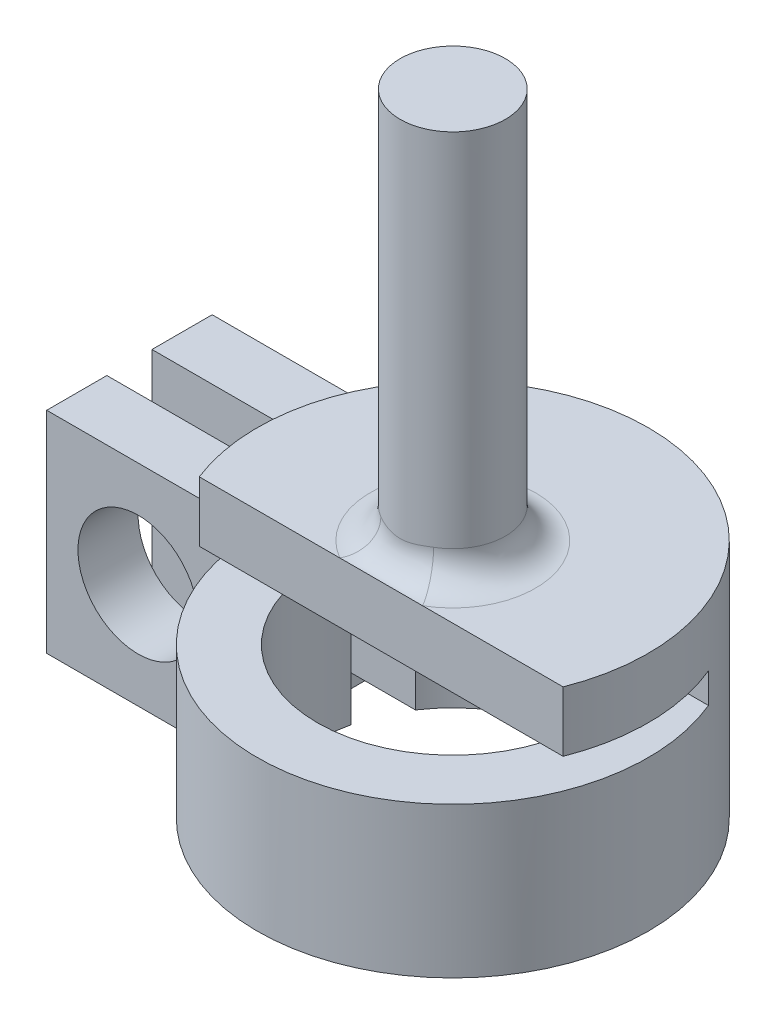
ISO-10303-21;
HEADER;
FILE_DESCRIPTION(('STEP AP214'),'2;1');
FILE_NAME('part.step','',(''),(''),'','','');
FILE_SCHEMA(('AUTOMOTIVE_DESIGN { 1 0 10303 214 1 1 1 1 }'));
ENDSEC;
DATA;
#1=APPLICATION_CONTEXT('core data for automotive mechanical design processes');
#2=APPLICATION_PROTOCOL_DEFINITION('international standard','automotive_design',2000,#1);
#3=PRODUCT_CONTEXT('',#1,'mechanical');
#4=PRODUCT('Part','Part','',(#3));
#5=PRODUCT_RELATED_PRODUCT_CATEGORY('part','',(#4));
#6=PRODUCT_DEFINITION_FORMATION('','',#4);
#7=PRODUCT_DEFINITION_CONTEXT('part definition',#1,'design');
#8=PRODUCT_DEFINITION('design','',#6,#7);
#9=PRODUCT_DEFINITION_SHAPE('','',#8);
#10=(LENGTH_UNIT() NAMED_UNIT(*) SI_UNIT(.MILLI.,.METRE.));
#11=(NAMED_UNIT(*) PLANE_ANGLE_UNIT() SI_UNIT($,.RADIAN.));
#12=(NAMED_UNIT(*) SI_UNIT($,.STERADIAN.) SOLID_ANGLE_UNIT());
#13=UNCERTAINTY_MEASURE_WITH_UNIT(LENGTH_MEASURE(1.E-05),#10,'distance_accuracy_value','');
#14=(GEOMETRIC_REPRESENTATION_CONTEXT(3) GLOBAL_UNCERTAINTY_ASSIGNED_CONTEXT((#13)) GLOBAL_UNIT_ASSIGNED_CONTEXT((#10,
#11,#12)) REPRESENTATION_CONTEXT('',''));
#15=CARTESIAN_POINT('',(0.,0.,0.));
#16=DIRECTION('',(0.,0.,1.));
#17=DIRECTION('',(1.,0.,0.));
#18=AXIS2_PLACEMENT_3D('',#15,#16,#17);
#19=CARTESIAN_POINT('',(0.,5.,0.));
#20=DIRECTION('',(0.,1.,0.));
#21=DIRECTION('',(0.,0.,1.));
#22=AXIS2_PLACEMENT_3D('',#19,#20,#21);
#23=PLANE('',#22);
#24=DIRECTION('',(1.,0.,0.));
#25=VECTOR('',#24,1.);
#26=CARTESIAN_POINT('',(-12.5,5.,-2.5));
#27=LINE('',#26,#25);
#28=CARTESIAN_POINT('',(-6.42261628933256,5.,-2.5));
#29=VERTEX_POINT('',#28);
#30=CARTESIAN_POINT('',(-6.,5.,-2.5));
#31=VERTEX_POINT('',#30);
#32=EDGE_CURVE('E337',#29,#31,#27,.T.);
#33=ORIENTED_EDGE('',*,*,#32,.T.);
#34=CARTESIAN_POINT('',(0.,5.,0.));
#35=DIRECTION('',(0.,1.,0.));
#36=DIRECTION('',(0.,0.,1.));
#37=AXIS2_PLACEMENT_3D('',#34,#35,#36);
#38=CIRCLE('',#37,6.5);
#39=CARTESIAN_POINT('',(-4.69041575982343,5.,-4.5));
#40=VERTEX_POINT('',#39);
#41=EDGE_CURVE('E224',#40,#31,#38,.T.);
#42=ORIENTED_EDGE('',*,*,#41,.F.);
#43=DIRECTION('',(-1.,0.,0.));
#44=VECTOR('',#43,1.);
#45=CARTESIAN_POINT('',(-4.69041575982343,5.,-4.5));
#46=LINE('',#45,#44);
#47=CARTESIAN_POINT('',(-6.42261628933256,5.,-4.5));
#48=VERTEX_POINT('',#47);
#49=EDGE_CURVE('E332',#40,#48,#46,.T.);
#50=ORIENTED_EDGE('',*,*,#49,.T.);
#51=DIRECTION('',(0.,0.,1.));
#52=VECTOR('',#51,1.);
#53=CARTESIAN_POINT('',(-6.42261628933256,5.,-10.6591064909357));
#54=LINE('',#53,#52);
#55=EDGE_CURVE('E319',#48,#29,#54,.T.);
#56=ORIENTED_EDGE('',*,*,#55,.T.);
#57=EDGE_LOOP('',(#33,#42,#50,#56));
#58=FACE_BOUND('',#57,.T.);
#59=ADVANCED_FACE('F39',(#58),#23,.T.);
#60=DIRECTION('',(1.,0.,0.));
#61=VECTOR('',#60,1.);
#62=CARTESIAN_POINT('',(4.89897948556636,5.,-2.5));
#63=LINE('',#62,#61);
#64=CARTESIAN_POINT('',(4.89897948556636,5.,-2.5));
#65=VERTEX_POINT('',#64);
#66=CARTESIAN_POINT('',(6.,5.,-2.5));
#67=VERTEX_POINT('',#66);
#68=EDGE_CURVE('E236',#65,#67,#63,.T.);
#69=ORIENTED_EDGE('',*,*,#68,.F.);
#70=CARTESIAN_POINT('',(0.,5.,0.));
#71=DIRECTION('',(0.,-1.,0.));
#72=DIRECTION('',(0.,0.,1.));
#73=AXIS2_PLACEMENT_3D('',#70,#71,#72);
#74=CIRCLE('',#73,5.5);
#75=CARTESIAN_POINT('',(-4.89897948556635,5.,-2.5));
#76=VERTEX_POINT('',#75);
#77=EDGE_CURVE('E227',#76,#65,#74,.T.);
#78=ORIENTED_EDGE('',*,*,#77,.F.);
#79=CARTESIAN_POINT('',(-3.74165738677394,5.,-2.5));
#80=VERTEX_POINT('',#79);
#81=EDGE_CURVE('E336',#76,#80,#27,.T.);
#82=ORIENTED_EDGE('',*,*,#81,.T.);
#83=CARTESIAN_POINT('',(0.,5.,0.));
#84=DIRECTION('',(0.,-1.,0.));
#85=DIRECTION('',(0.,0.,1.));
#86=AXIS2_PLACEMENT_3D('',#83,#84,#85);
#87=CIRCLE('',#86,4.5);
#88=CARTESIAN_POINT('',(-4.38748219369606,5.,-0.999999999999997));
#89=VERTEX_POINT('',#88);
#90=EDGE_CURVE('E339',#80,#89,#87,.T.);
#91=ORIENTED_EDGE('',*,*,#90,.T.);
#92=DIRECTION('',(-1.,0.,0.));
#93=VECTOR('',#92,1.);
#94=CARTESIAN_POINT('',(-4.38748219369606,5.,-0.999999999999998));
#95=LINE('',#94,#93);
#96=CARTESIAN_POINT('',(-6.42261628933256,5.,-1.));
#97=VERTEX_POINT('',#96);
#98=EDGE_CURVE('E341',#89,#97,#95,.T.);
#99=ORIENTED_EDGE('',*,*,#98,.T.);
#100=CARTESIAN_POINT('',(-6.42261628933256,5.,1.));
#101=VERTEX_POINT('',#100);
#102=EDGE_CURVE('E329',#97,#101,#54,.T.);
#103=ORIENTED_EDGE('',*,*,#102,.T.);
#104=CARTESIAN_POINT('',(0.,5.,0.));
#105=DIRECTION('',(0.,1.,0.));
#106=DIRECTION('',(0.,0.,1.));
#107=AXIS2_PLACEMENT_3D('',#104,#105,#106);
#108=CIRCLE('',#107,6.5);
#109=EDGE_CURVE('E330',#101,#67,#108,.T.);
#110=ORIENTED_EDGE('',*,*,#109,.T.);
#111=EDGE_LOOP('',(#69,#78,#82,#91,#99,#103,#110));
#112=FACE_BOUND('',#111,.T.);
#113=ADVANCED_FACE('F442',(#112),#23,.T.);
#114=CARTESIAN_POINT('',(-12.5,5.,-0.999999999999997));
#115=DIRECTION('',(1.,0.,0.));
#116=DIRECTION('',(0.,0.,-1.));
#117=AXIS2_PLACEMENT_3D('',#114,#115,#116);
#118=PLANE('',#117);
#119=DIRECTION('',(0.,0.,1.));
#120=VECTOR('',#119,1.);
#121=CARTESIAN_POINT('',(-12.5,-1.,-10.6591064909357));
#122=LINE('',#121,#120);
#123=CARTESIAN_POINT('',(-12.5,-1.,-4.5));
#124=VERTEX_POINT('',#123);
#125=CARTESIAN_POINT('',(-12.5,-1.,-2.5));
#126=VERTEX_POINT('',#125);
#127=EDGE_CURVE('E302',#124,#126,#122,.T.);
#128=ORIENTED_EDGE('',*,*,#127,.T.);
#129=DIRECTION('',(0.,-1.,0.));
#130=VECTOR('',#129,1.);
#131=CARTESIAN_POINT('',(-12.5,5.,-2.5));
#132=LINE('',#131,#130);
#133=CARTESIAN_POINT('',(-12.5,6.,-2.5));
#134=VERTEX_POINT('',#133);
#135=EDGE_CURVE('E368',#134,#126,#132,.T.);
#136=ORIENTED_EDGE('',*,*,#135,.F.);
#137=DIRECTION('',(0.,0.,1.));
#138=VECTOR('',#137,1.);
#139=CARTESIAN_POINT('',(-12.5,6.,-10.6591064909357));
#140=LINE('',#139,#138);
#141=CARTESIAN_POINT('',(-12.5,6.,-4.5));
#142=VERTEX_POINT('',#141);
#143=EDGE_CURVE('E311',#142,#134,#140,.T.);
#144=ORIENTED_EDGE('',*,*,#143,.F.);
#145=DIRECTION('',(0.,-1.,0.));
#146=VECTOR('',#145,1.);
#147=CARTESIAN_POINT('',(-12.5,5.,-4.5));
#148=LINE('',#147,#146);
#149=EDGE_CURVE('E370',#142,#124,#148,.T.);
#150=ORIENTED_EDGE('',*,*,#149,.T.);
#151=EDGE_LOOP('',(#128,#136,#144,#150));
#152=FACE_BOUND('',#151,.T.);
#153=ADVANCED_FACE('F511',(#152),#118,.F.);
#154=CARTESIAN_POINT('',(-12.5,6.,-10.6591064909357));
#155=DIRECTION('',(0.,1.,0.));
#156=DIRECTION('',(0.,0.,1.));
#157=AXIS2_PLACEMENT_3D('',#154,#155,#156);
#158=PLANE('',#157);
#159=DIRECTION('',(-1.,0.,0.));
#160=VECTOR('',#159,1.);
#161=CARTESIAN_POINT('',(-2.5,6.,-2.5));
#162=LINE('',#161,#160);
#163=CARTESIAN_POINT('',(-6.42261628933256,6.,-2.5));
#164=VERTEX_POINT('',#163);
#165=EDGE_CURVE('E271',#164,#134,#162,.T.);
#166=ORIENTED_EDGE('',*,*,#165,.F.);
#167=DIRECTION('',(0.,0.,1.));
#168=VECTOR('',#167,1.);
#169=CARTESIAN_POINT('',(-6.42261628933256,6.,-10.6591064909357));
#170=LINE('',#169,#168);
#171=CARTESIAN_POINT('',(-6.42261628933256,6.,-4.5));
#172=VERTEX_POINT('',#171);
#173=EDGE_CURVE('E323',#172,#164,#170,.T.);
#174=ORIENTED_EDGE('',*,*,#173,.F.);
#175=DIRECTION('',(1.,0.,0.));
#176=VECTOR('',#175,1.);
#177=CARTESIAN_POINT('',(-12.5,6.,-4.5));
#178=LINE('',#177,#176);
#179=EDGE_CURVE('E310',#142,#172,#178,.T.);
#180=ORIENTED_EDGE('',*,*,#179,.F.);
#181=ORIENTED_EDGE('',*,*,#143,.T.);
#182=EDGE_LOOP('',(#166,#174,#180,#181));
#183=FACE_BOUND('',#182,.T.);
#184=ADVANCED_FACE('F503',(#183),#158,.T.);
#185=CARTESIAN_POINT('',(-6.42261628933256,5.,-10.6591064909357));
#186=DIRECTION('',(1.,0.,0.));
#187=DIRECTION('',(0.,0.,-1.));
#188=AXIS2_PLACEMENT_3D('',#185,#186,#187);
#189=PLANE('',#188);
#190=DIRECTION('',(0.,1.,0.));
#191=VECTOR('',#190,1.);
#192=CARTESIAN_POINT('',(-6.42261628933256,5.,-2.5));
#193=LINE('',#192,#191);
#194=EDGE_CURVE('E282',#29,#164,#193,.T.);
#195=ORIENTED_EDGE('',*,*,#194,.F.);
#196=ORIENTED_EDGE('',*,*,#55,.F.);
#197=DIRECTION('',(0.,-1.,0.));
#198=VECTOR('',#197,1.);
#199=CARTESIAN_POINT('',(-6.42261628933256,5.,-4.5));
#200=LINE('',#199,#198);
#201=EDGE_CURVE('E308',#172,#48,#200,.T.);
#202=ORIENTED_EDGE('',*,*,#201,.F.);
#203=ORIENTED_EDGE('',*,*,#173,.T.);
#204=EDGE_LOOP('',(#195,#196,#202,#203));
#205=FACE_BOUND('',#204,.T.);
#206=ADVANCED_FACE('F495',(#205),#189,.T.);
#207=CARTESIAN_POINT('',(-6.42261628933256,0.,-10.6591064909357));
#208=DIRECTION('',(1.,0.,0.));
#209=DIRECTION('',(0.,0.,-1.));
#210=AXIS2_PLACEMENT_3D('',#207,#208,#209);
#211=PLANE('',#210);
#212=DIRECTION('',(0.,1.,0.));
#213=VECTOR('',#212,1.);
#214=CARTESIAN_POINT('',(-6.42261628933256,0.,-2.5));
#215=LINE('',#214,#213);
#216=CARTESIAN_POINT('',(-6.42261628933256,-1.,-2.5));
#217=VERTEX_POINT('',#216);
#218=CARTESIAN_POINT('',(-6.42261628933256,0.,-2.5));
#219=VERTEX_POINT('',#218);
#220=EDGE_CURVE('E280',#217,#219,#215,.T.);
#221=ORIENTED_EDGE('',*,*,#220,.F.);
#222=DIRECTION('',(0.,0.,1.));
#223=VECTOR('',#222,1.);
#224=CARTESIAN_POINT('',(-6.42261628933256,-1.,-10.6591064909357));
#225=LINE('',#224,#223);
#226=CARTESIAN_POINT('',(-6.42261628933256,-1.,-4.5));
#227=VERTEX_POINT('',#226);
#228=EDGE_CURVE('E297',#227,#217,#225,.T.);
#229=ORIENTED_EDGE('',*,*,#228,.F.);
#230=DIRECTION('',(0.,-1.,0.));
#231=VECTOR('',#230,1.);
#232=CARTESIAN_POINT('',(-6.42261628933256,0.,-4.5));
#233=LINE('',#232,#231);
#234=CARTESIAN_POINT('',(-6.42261628933256,0.,-4.5));
#235=VERTEX_POINT('',#234);
#236=EDGE_CURVE('E285',#235,#227,#233,.T.);
#237=ORIENTED_EDGE('',*,*,#236,.F.);
#238=DIRECTION('',(0.,0.,1.));
#239=VECTOR('',#238,1.);
#240=CARTESIAN_POINT('',(-6.42261628933256,0.,-10.6591064909357));
#241=LINE('',#240,#239);
#242=EDGE_CURVE('E288',#235,#219,#241,.T.);
#243=ORIENTED_EDGE('',*,*,#242,.T.);
#244=EDGE_LOOP('',(#221,#229,#237,#243));
#245=FACE_BOUND('',#244,.T.);
#246=ADVANCED_FACE('F474',(#245),#211,.T.);
#247=CARTESIAN_POINT('',(-12.5,-1.,-10.6591064909357));
#248=DIRECTION('',(0.,-1.,0.));
#249=DIRECTION('',(0.,0.,-1.));
#250=AXIS2_PLACEMENT_3D('',#247,#248,#249);
#251=PLANE('',#250);
#252=DIRECTION('',(1.,0.,0.));
#253=VECTOR('',#252,1.);
#254=CARTESIAN_POINT('',(-12.5,-1.,-2.5));
#255=LINE('',#254,#253);
#256=EDGE_CURVE('E378',#126,#217,#255,.T.);
#257=ORIENTED_EDGE('',*,*,#256,.F.);
#258=ORIENTED_EDGE('',*,*,#127,.F.);
#259=DIRECTION('',(-1.,0.,0.));
#260=VECTOR('',#259,1.);
#261=CARTESIAN_POINT('',(-12.5,-1.,-4.5));
#262=LINE('',#261,#260);
#263=EDGE_CURVE('E287',#227,#124,#262,.T.);
#264=ORIENTED_EDGE('',*,*,#263,.F.);
#265=ORIENTED_EDGE('',*,*,#228,.T.);
#266=EDGE_LOOP('',(#257,#258,#264,#265));
#267=FACE_BOUND('',#266,.T.);
#268=ADVANCED_FACE('F515',(#267),#251,.T.);
#269=CARTESIAN_POINT('',(0.,0.,0.));
#270=DIRECTION('',(0.,1.,0.));
#271=DIRECTION('',(0.,0.,1.));
#272=AXIS2_PLACEMENT_3D('',#269,#270,#271);
#273=PLANE('',#272);
#274=ORIENTED_EDGE('',*,*,#242,.F.);
#275=DIRECTION('',(-1.,0.,0.));
#276=VECTOR('',#275,1.);
#277=CARTESIAN_POINT('',(-4.69041575982343,0.,-4.5));
#278=LINE('',#277,#276);
#279=CARTESIAN_POINT('',(-4.69041575982343,0.,-4.5));
#280=VERTEX_POINT('',#279);
#281=EDGE_CURVE('E346',#280,#235,#278,.T.);
#282=ORIENTED_EDGE('',*,*,#281,.F.);
#283=CARTESIAN_POINT('',(0.,0.,0.));
#284=DIRECTION('',(0.,1.,0.));
#285=DIRECTION('',(0.,0.,1.));
#286=AXIS2_PLACEMENT_3D('',#283,#284,#285);
#287=CIRCLE('',#286,6.5);
#288=CARTESIAN_POINT('',(-6.42261628933256,0.,1.));
#289=VERTEX_POINT('',#288);
#290=EDGE_CURVE('E313',#289,#280,#287,.T.);
#291=ORIENTED_EDGE('',*,*,#290,.F.);
#292=CARTESIAN_POINT('',(-6.42261628933256,0.,-0.999999999999996));
#293=VERTEX_POINT('',#292);
#294=EDGE_CURVE('E298',#293,#289,#241,.T.);
#295=ORIENTED_EDGE('',*,*,#294,.F.);
#296=DIRECTION('',(-1.,0.,0.));
#297=VECTOR('',#296,1.);
#298=CARTESIAN_POINT('',(-4.38748219369606,0.,-0.999999999999998));
#299=LINE('',#298,#297);
#300=CARTESIAN_POINT('',(-4.38748219369606,0.,-0.999999999999997));
#301=VERTEX_POINT('',#300);
#302=EDGE_CURVE('E333',#301,#293,#299,.T.);
#303=ORIENTED_EDGE('',*,*,#302,.F.);
#304=CARTESIAN_POINT('',(0.,0.,0.));
#305=DIRECTION('',(0.,-1.,0.));
#306=DIRECTION('',(0.,0.,1.));
#307=AXIS2_PLACEMENT_3D('',#304,#305,#306);
#308=CIRCLE('',#307,4.5);
#309=CARTESIAN_POINT('',(-3.74165738677394,0.,-2.5));
#310=VERTEX_POINT('',#309);
#311=EDGE_CURVE('E351',#310,#301,#308,.T.);
#312=ORIENTED_EDGE('',*,*,#311,.F.);
#313=DIRECTION('',(1.,0.,0.));
#314=VECTOR('',#313,1.);
#315=CARTESIAN_POINT('',(-12.5,0.,-2.5));
#316=LINE('',#315,#314);
#317=EDGE_CURVE('E349',#219,#310,#316,.T.);
#318=ORIENTED_EDGE('',*,*,#317,.F.);
#319=EDGE_LOOP('',(#274,#282,#291,#295,#303,#312,#318));
#320=FACE_BOUND('',#319,.T.);
#321=ADVANCED_FACE('F459',(#320),#273,.F.);
#322=CARTESIAN_POINT('',(0.,5.,0.));
#323=DIRECTION('',(0.,-1.,0.));
#324=DIRECTION('',(0.,0.,-1.));
#325=AXIS2_PLACEMENT_3D('',#322,#323,#324);
#326=CYLINDRICAL_SURFACE('',#325,6.5);
#327=ORIENTED_EDGE('',*,*,#290,.T.);
#328=DIRECTION('',(0.,-1.,0.));
#329=VECTOR('',#328,1.);
#330=CARTESIAN_POINT('',(-4.69041575982343,5.,-4.5));
#331=LINE('',#330,#329);
#332=EDGE_CURVE('E372',#40,#280,#331,.T.);
#333=ORIENTED_EDGE('',*,*,#332,.F.);
#334=ORIENTED_EDGE('',*,*,#41,.T.);
#335=DIRECTION('',(0.,-1.,0.));
#336=VECTOR('',#335,1.);
#337=CARTESIAN_POINT('',(-6.,6.,-2.5));
#338=LINE('',#337,#336);
#339=CARTESIAN_POINT('',(-6.,6.,-2.5));
#340=VERTEX_POINT('',#339);
#341=EDGE_CURVE('E255',#340,#31,#338,.T.);
#342=ORIENTED_EDGE('',*,*,#341,.F.);
#343=CARTESIAN_POINT('',(0.,6.,0.));
#344=DIRECTION('',(0.,1.,0.));
#345=DIRECTION('',(0.,0.,1.));
#346=AXIS2_PLACEMENT_3D('',#343,#344,#345);
#347=CIRCLE('',#346,6.5);
#348=CARTESIAN_POINT('',(-6.42261628933256,6.,-0.999999999999997));
#349=VERTEX_POINT('',#348);
#350=EDGE_CURVE('E428',#340,#349,#347,.T.);
#351=ORIENTED_EDGE('',*,*,#350,.T.);
#352=CARTESIAN_POINT('',(-6.42261628933257,6.,1.));
#353=VERTEX_POINT('',#352);
#354=EDGE_CURVE('E424',#349,#353,#347,.T.);
#355=ORIENTED_EDGE('',*,*,#354,.T.);
#356=CARTESIAN_POINT('',(-6.04844047152914,6.,2.38041338056405));
#357=VERTEX_POINT('',#356);
#358=EDGE_CURVE('E222',#353,#357,#347,.T.);
#359=ORIENTED_EDGE('',*,*,#358,.T.);
#360=DIRECTION('',(0.,-1.,0.));
#361=VECTOR('',#360,1.);
#362=CARTESIAN_POINT('',(-6.04844047152914,8.,2.38041338056405));
#363=LINE('',#362,#361);
#364=CARTESIAN_POINT('',(-6.04844047152914,8.,2.38041338056405));
#365=VERTEX_POINT('',#364);
#366=EDGE_CURVE('E205',#365,#357,#363,.T.);
#367=ORIENTED_EDGE('',*,*,#366,.F.);
#368=CARTESIAN_POINT('',(0.,8.,0.));
#369=DIRECTION('',(0.,1.,0.));
#370=DIRECTION('',(0.,0.,1.));
#371=AXIS2_PLACEMENT_3D('',#368,#369,#370);
#372=CIRCLE('',#371,6.5);
#373=CARTESIAN_POINT('',(6.04844047152914,8.,2.38041338056405));
#374=VERTEX_POINT('',#373);
#375=EDGE_CURVE('E211',#374,#365,#372,.T.);
#376=ORIENTED_EDGE('',*,*,#375,.F.);
#377=DIRECTION('',(0.,-1.,0.));
#378=VECTOR('',#377,1.);
#379=CARTESIAN_POINT('',(6.04844047152914,8.,2.38041338056405));
#380=LINE('',#379,#378);
#381=CARTESIAN_POINT('',(6.04844047152914,6.,2.38041338056405));
#382=VERTEX_POINT('',#381);
#383=EDGE_CURVE('E207',#374,#382,#380,.T.);
#384=ORIENTED_EDGE('',*,*,#383,.T.);
#385=CARTESIAN_POINT('',(6.,6.,-2.5));
#386=VERTEX_POINT('',#385);
#387=EDGE_CURVE('E426',#382,#386,#347,.T.);
#388=ORIENTED_EDGE('',*,*,#387,.T.);
#389=DIRECTION('',(0.,-1.,0.));
#390=VECTOR('',#389,1.);
#391=CARTESIAN_POINT('',(6.,6.,-2.5));
#392=LINE('',#391,#390);
#393=EDGE_CURVE('E241',#386,#67,#392,.T.);
#394=ORIENTED_EDGE('',*,*,#393,.T.);
#395=ORIENTED_EDGE('',*,*,#109,.F.);
#396=DIRECTION('',(0.,-1.,0.));
#397=VECTOR('',#396,1.);
#398=CARTESIAN_POINT('',(-6.42261628933256,5.,1.));
#399=LINE('',#398,#397);
#400=EDGE_CURVE('E344',#101,#289,#399,.T.);
#401=ORIENTED_EDGE('',*,*,#400,.T.);
#402=EDGE_LOOP('',(#327,#333,#334,#342,#351,#355,#359,#367,#376,#384,#388,#394,#395,#401));
#403=FACE_BOUND('',#402,.T.);
#404=ADVANCED_FACE('F219',(#403),#326,.T.);
#405=CARTESIAN_POINT('',(-4.69041575982343,5.,-4.5));
#406=DIRECTION('',(0.,0.,1.));
#407=DIRECTION('',(1.,0.,0.));
#408=AXIS2_PLACEMENT_3D('',#405,#406,#407);
#409=PLANE('',#408);
#410=CARTESIAN_POINT('',(-9.46130814466628,2.5,-4.5));
#411=DIRECTION('',(0.,0.,1.));
#412=DIRECTION('',(1.,0.,0.));
#413=AXIS2_PLACEMENT_3D('',#410,#411,#412);
#414=CIRCLE('',#413,2.);
#415=CARTESIAN_POINT('',(-7.46130814466628,2.5,-4.5));
#416=VERTEX_POINT('',#415);
#417=EDGE_CURVE('E267',#416,#416,#414,.T.);
#418=ORIENTED_EDGE('',*,*,#417,.T.);
#419=EDGE_LOOP('',(#418));
#420=FACE_BOUND('',#419,.T.);
#421=ORIENTED_EDGE('',*,*,#281,.T.);
#422=ORIENTED_EDGE('',*,*,#236,.T.);
#423=ORIENTED_EDGE('',*,*,#263,.T.);
#424=ORIENTED_EDGE('',*,*,#149,.F.);
#425=ORIENTED_EDGE('',*,*,#179,.T.);
#426=ORIENTED_EDGE('',*,*,#201,.T.);
#427=ORIENTED_EDGE('',*,*,#49,.F.);
#428=ORIENTED_EDGE('',*,*,#332,.T.);
#429=EDGE_LOOP('',(#421,#422,#423,#424,#425,#426,#427,#428));
#430=FACE_BOUND('',#429,.T.);
#431=ADVANCED_FACE('F478',(#420,#430),#409,.F.);
#432=CARTESIAN_POINT('',(-12.5,5.,-2.5));
#433=DIRECTION('',(0.,0.,-1.));
#434=DIRECTION('',(-1.,0.,0.));
#435=AXIS2_PLACEMENT_3D('',#432,#433,#434);
#436=PLANE('',#435);
#437=CARTESIAN_POINT('',(-9.46130814466628,2.5,-2.5));
#438=DIRECTION('',(0.,0.,-1.));
#439=DIRECTION('',(-1.,0.,0.));
#440=AXIS2_PLACEMENT_3D('',#437,#438,#439);
#441=CIRCLE('',#440,2.);
#442=CARTESIAN_POINT('',(-11.4613081446663,2.5,-2.5));
#443=VERTEX_POINT('',#442);
#444=EDGE_CURVE('E264',#443,#443,#441,.T.);
#445=ORIENTED_EDGE('',*,*,#444,.T.);
#446=EDGE_LOOP('',(#445));
#447=FACE_BOUND('',#446,.T.);
#448=ORIENTED_EDGE('',*,*,#135,.T.);
#449=ORIENTED_EDGE('',*,*,#256,.T.);
#450=ORIENTED_EDGE('',*,*,#220,.T.);
#451=ORIENTED_EDGE('',*,*,#317,.T.);
#452=DIRECTION('',(0.,-1.,0.));
#453=VECTOR('',#452,1.);
#454=CARTESIAN_POINT('',(-3.74165738677394,5.,-2.5));
#455=LINE('',#454,#453);
#456=EDGE_CURVE('E365',#80,#310,#455,.T.);
#457=ORIENTED_EDGE('',*,*,#456,.F.);
#458=ORIENTED_EDGE('',*,*,#81,.F.);
#459=DIRECTION('',(0.,-1.,0.));
#460=VECTOR('',#459,1.);
#461=CARTESIAN_POINT('',(-4.89897948556635,6.,-2.5));
#462=LINE('',#461,#460);
#463=CARTESIAN_POINT('',(-4.89897948556635,6.,-2.5));
#464=VERTEX_POINT('',#463);
#465=EDGE_CURVE('E252',#464,#76,#462,.T.);
#466=ORIENTED_EDGE('',*,*,#465,.F.);
#467=DIRECTION('',(1.,0.,0.));
#468=VECTOR('',#467,1.);
#469=CARTESIAN_POINT('',(-6.,6.,-2.5));
#470=LINE('',#469,#468);
#471=EDGE_CURVE('E232',#340,#464,#470,.T.);
#472=ORIENTED_EDGE('',*,*,#471,.F.);
#473=ORIENTED_EDGE('',*,*,#341,.T.);
#474=ORIENTED_EDGE('',*,*,#32,.F.);
#475=ORIENTED_EDGE('',*,*,#194,.T.);
#476=ORIENTED_EDGE('',*,*,#165,.T.);
#477=EDGE_LOOP('',(#448,#449,#450,#451,#457,#458,#466,#472,#473,#474,#475,#476));
#478=FACE_BOUND('',#477,.T.);
#479=ADVANCED_FACE('F486',(#447,#478),#436,.F.);
#480=CARTESIAN_POINT('',(0.,5.,0.));
#481=DIRECTION('',(0.,-1.,0.));
#482=DIRECTION('',(0.,0.,-1.));
#483=AXIS2_PLACEMENT_3D('',#480,#481,#482);
#484=CYLINDRICAL_SURFACE('',#483,4.5);
#485=ORIENTED_EDGE('',*,*,#311,.T.);
#486=DIRECTION('',(0.,-1.,0.));
#487=VECTOR('',#486,1.);
#488=CARTESIAN_POINT('',(-4.38748219369606,5.,-0.999999999999997));
#489=LINE('',#488,#487);
#490=EDGE_CURVE('E362',#89,#301,#489,.T.);
#491=ORIENTED_EDGE('',*,*,#490,.F.);
#492=ORIENTED_EDGE('',*,*,#90,.F.);
#493=ORIENTED_EDGE('',*,*,#456,.T.);
#494=EDGE_LOOP('',(#485,#491,#492,#493));
#495=FACE_BOUND('',#494,.T.);
#496=ADVANCED_FACE('F467',(#495),#484,.F.);
#497=CARTESIAN_POINT('',(-4.38748219369606,5.,-0.999999999999998));
#498=DIRECTION('',(0.,0.,1.));
#499=DIRECTION('',(1.,0.,0.));
#500=AXIS2_PLACEMENT_3D('',#497,#498,#499);
#501=PLANE('',#500);
#502=CARTESIAN_POINT('',(-9.46130814466628,2.5,-0.999999999999997));
#503=DIRECTION('',(0.,0.,1.));
#504=DIRECTION('',(1.,0.,0.));
#505=AXIS2_PLACEMENT_3D('',#502,#503,#504);
#506=CIRCLE('',#505,2.);
#507=CARTESIAN_POINT('',(-7.46130814466628,2.5,-0.999999999999997));
#508=VERTEX_POINT('',#507);
#509=EDGE_CURVE('E261',#508,#508,#506,.T.);
#510=ORIENTED_EDGE('',*,*,#509,.T.);
#511=EDGE_LOOP('',(#510));
#512=FACE_BOUND('',#511,.T.);
#513=ORIENTED_EDGE('',*,*,#302,.T.);
#514=DIRECTION('',(0.,-1.,0.));
#515=VECTOR('',#514,1.);
#516=CARTESIAN_POINT('',(-6.42261628933256,0.,-0.999999999999996));
#517=LINE('',#516,#515);
#518=CARTESIAN_POINT('',(-6.42261628933256,-1.,-0.999999999999999));
#519=VERTEX_POINT('',#518);
#520=EDGE_CURVE('E274',#293,#519,#517,.T.);
#521=ORIENTED_EDGE('',*,*,#520,.T.);
#522=DIRECTION('',(-1.,0.,0.));
#523=VECTOR('',#522,1.);
#524=CARTESIAN_POINT('',(-12.5,-1.,-0.999999999999996));
#525=LINE('',#524,#523);
#526=CARTESIAN_POINT('',(-12.5,-1.,-0.999999999999996));
#527=VERTEX_POINT('',#526);
#528=EDGE_CURVE('E375',#519,#527,#525,.T.);
#529=ORIENTED_EDGE('',*,*,#528,.T.);
#530=DIRECTION('',(0.,-1.,0.));
#531=VECTOR('',#530,1.);
#532=CARTESIAN_POINT('',(-12.5,5.,-0.999999999999997));
#533=LINE('',#532,#531);
#534=CARTESIAN_POINT('',(-12.5,6.,-0.999999999999997));
#535=VERTEX_POINT('',#534);
#536=EDGE_CURVE('E360',#535,#527,#533,.T.);
#537=ORIENTED_EDGE('',*,*,#536,.F.);
#538=DIRECTION('',(-1.,0.,0.));
#539=VECTOR('',#538,1.);
#540=CARTESIAN_POINT('',(-2.5,6.,-0.999999999999997));
#541=LINE('',#540,#539);
#542=EDGE_CURVE('E270',#349,#535,#541,.T.);
#543=ORIENTED_EDGE('',*,*,#542,.F.);
#544=DIRECTION('',(0.,-1.,0.));
#545=VECTOR('',#544,1.);
#546=CARTESIAN_POINT('',(-6.42261628933256,5.,-0.999999999999997));
#547=LINE('',#546,#545);
#548=EDGE_CURVE('E278',#349,#97,#547,.T.);
#549=ORIENTED_EDGE('',*,*,#548,.T.);
#550=ORIENTED_EDGE('',*,*,#98,.F.);
#551=ORIENTED_EDGE('',*,*,#490,.T.);
#552=EDGE_LOOP('',(#513,#521,#529,#537,#543,#549,#550,#551));
#553=FACE_BOUND('',#552,.T.);
#554=ADVANCED_FACE('F462',(#512,#553),#501,.F.);
#555=CARTESIAN_POINT('',(-12.5,6.,1.));
#556=VERTEX_POINT('',#555);
#557=EDGE_CURVE('E322',#535,#556,#140,.T.);
#558=ORIENTED_EDGE('',*,*,#557,.F.);
#559=ORIENTED_EDGE('',*,*,#536,.T.);
#560=CARTESIAN_POINT('',(-12.5,-1.,1.));
#561=VERTEX_POINT('',#560);
#562=EDGE_CURVE('E294',#527,#561,#122,.T.);
#563=ORIENTED_EDGE('',*,*,#562,.T.);
#564=DIRECTION('',(0.,-1.,0.));
#565=VECTOR('',#564,1.);
#566=CARTESIAN_POINT('',(-12.5,5.,1.));
#567=LINE('',#566,#565);
#568=EDGE_CURVE('E357',#556,#561,#567,.T.);
#569=ORIENTED_EDGE('',*,*,#568,.F.);
#570=EDGE_LOOP('',(#558,#559,#563,#569));
#571=FACE_BOUND('',#570,.T.);
#572=ADVANCED_FACE('F518',(#571),#118,.F.);
#573=CARTESIAN_POINT('',(-12.5,5.,1.));
#574=DIRECTION('',(0.,0.,-1.));
#575=DIRECTION('',(-1.,0.,0.));
#576=AXIS2_PLACEMENT_3D('',#573,#574,#575);
#577=PLANE('',#576);
#578=CARTESIAN_POINT('',(-9.46130814466628,2.5,1.));
#579=DIRECTION('',(0.,0.,1.));
#580=DIRECTION('',(1.,0.,0.));
#581=AXIS2_PLACEMENT_3D('',#578,#579,#580);
#582=CIRCLE('',#581,2.);
#583=CARTESIAN_POINT('',(-7.46130814466628,2.5,1.));
#584=VERTEX_POINT('',#583);
#585=EDGE_CURVE('E258',#584,#584,#582,.T.);
#586=ORIENTED_EDGE('',*,*,#585,.F.);
#587=EDGE_LOOP('',(#586));
#588=FACE_BOUND('',#587,.T.);
#589=ORIENTED_EDGE('',*,*,#568,.T.);
#590=DIRECTION('',(1.,0.,0.));
#591=VECTOR('',#590,1.);
#592=CARTESIAN_POINT('',(-12.5,-1.,1.));
#593=LINE('',#592,#591);
#594=CARTESIAN_POINT('',(-6.42261628933256,-1.,1.));
#595=VERTEX_POINT('',#594);
#596=EDGE_CURVE('E284',#561,#595,#593,.T.);
#597=ORIENTED_EDGE('',*,*,#596,.T.);
#598=DIRECTION('',(0.,1.,0.));
#599=VECTOR('',#598,1.);
#600=CARTESIAN_POINT('',(-6.42261628933256,0.,1.));
#601=LINE('',#600,#599);
#602=EDGE_CURVE('E291',#595,#289,#601,.T.);
#603=ORIENTED_EDGE('',*,*,#602,.T.);
#604=ORIENTED_EDGE('',*,*,#400,.F.);
#605=DIRECTION('',(0.,1.,0.));
#606=VECTOR('',#605,1.);
#607=CARTESIAN_POINT('',(-6.42261628933256,5.,1.));
#608=LINE('',#607,#606);
#609=EDGE_CURVE('E307',#101,#353,#608,.T.);
#610=ORIENTED_EDGE('',*,*,#609,.T.);
#611=DIRECTION('',(-1.,0.,0.));
#612=VECTOR('',#611,1.);
#613=CARTESIAN_POINT('',(-12.5,6.,1.));
#614=LINE('',#613,#612);
#615=EDGE_CURVE('E316',#353,#556,#614,.T.);
#616=ORIENTED_EDGE('',*,*,#615,.T.);
#617=EDGE_LOOP('',(#589,#597,#603,#604,#610,#616));
#618=FACE_BOUND('',#617,.T.);
#619=ADVANCED_FACE('F449',(#588,#618),#577,.F.);
#620=ORIENTED_EDGE('',*,*,#354,.F.);
#621=ORIENTED_EDGE('',*,*,#542,.T.);
#622=ORIENTED_EDGE('',*,*,#557,.T.);
#623=ORIENTED_EDGE('',*,*,#615,.F.);
#624=EDGE_LOOP('',(#620,#621,#622,#623));
#625=FACE_BOUND('',#624,.T.);
#626=ADVANCED_FACE('F490',(#625),#158,.T.);
#627=ORIENTED_EDGE('',*,*,#548,.F.);
#628=EDGE_CURVE('E326',#349,#353,#170,.T.);
#629=ORIENTED_EDGE('',*,*,#628,.T.);
#630=ORIENTED_EDGE('',*,*,#609,.F.);
#631=ORIENTED_EDGE('',*,*,#102,.F.);
#632=EDGE_LOOP('',(#627,#629,#630,#631));
#633=FACE_BOUND('',#632,.T.);
#634=ADVANCED_FACE('F492',(#633),#189,.T.);
#635=ORIENTED_EDGE('',*,*,#520,.F.);
#636=ORIENTED_EDGE('',*,*,#294,.T.);
#637=ORIENTED_EDGE('',*,*,#602,.F.);
#638=EDGE_CURVE('E301',#519,#595,#225,.T.);
#639=ORIENTED_EDGE('',*,*,#638,.F.);
#640=EDGE_LOOP('',(#635,#636,#637,#639));
#641=FACE_BOUND('',#640,.T.);
#642=ADVANCED_FACE('F455',(#641),#211,.T.);
#643=ORIENTED_EDGE('',*,*,#528,.F.);
#644=ORIENTED_EDGE('',*,*,#638,.T.);
#645=ORIENTED_EDGE('',*,*,#596,.F.);
#646=ORIENTED_EDGE('',*,*,#562,.F.);
#647=EDGE_LOOP('',(#643,#644,#645,#646));
#648=FACE_BOUND('',#647,.T.);
#649=ADVANCED_FACE('F500',(#648),#251,.T.);
#650=CARTESIAN_POINT('',(-9.46130814466628,2.5,-9.));
#651=DIRECTION('',(0.,0.,1.));
#652=DIRECTION('',(1.,0.,0.));
#653=AXIS2_PLACEMENT_3D('',#650,#651,#652);
#654=CYLINDRICAL_SURFACE('',#653,2.);
#655=ORIENTED_EDGE('',*,*,#585,.T.);
#656=EDGE_LOOP('',(#655));
#657=FACE_BOUND('',#656,.T.);
#658=ORIENTED_EDGE('',*,*,#509,.F.);
#659=EDGE_LOOP('',(#658));
#660=FACE_BOUND('',#659,.T.);
#661=ADVANCED_FACE('F540',(#657,#660),#654,.F.);
#662=ORIENTED_EDGE('',*,*,#444,.F.);
#663=EDGE_LOOP('',(#662));
#664=FACE_BOUND('',#663,.T.);
#665=ORIENTED_EDGE('',*,*,#417,.F.);
#666=EDGE_LOOP('',(#665));
#667=FACE_BOUND('',#666,.T.);
#668=ADVANCED_FACE('F537',(#664,#667),#654,.F.);
#669=CARTESIAN_POINT('',(0.,6.,0.));
#670=DIRECTION('',(0.,-1.,0.));
#671=DIRECTION('',(0.,0.,-1.));
#672=AXIS2_PLACEMENT_3D('',#669,#670,#671);
#673=CYLINDRICAL_SURFACE('',#672,5.5);
#674=ORIENTED_EDGE('',*,*,#77,.T.);
#675=DIRECTION('',(0.,-1.,0.));
#676=VECTOR('',#675,1.);
#677=CARTESIAN_POINT('',(4.89897948556636,6.,-2.5));
#678=LINE('',#677,#676);
#679=CARTESIAN_POINT('',(4.89897948556636,6.,-2.5));
#680=VERTEX_POINT('',#679);
#681=EDGE_CURVE('E249',#680,#65,#678,.T.);
#682=ORIENTED_EDGE('',*,*,#681,.F.);
#683=CARTESIAN_POINT('',(0.,6.,0.));
#684=DIRECTION('',(0.,-1.,0.));
#685=DIRECTION('',(0.,0.,1.));
#686=AXIS2_PLACEMENT_3D('',#683,#684,#685);
#687=CIRCLE('',#686,5.5);
#688=EDGE_CURVE('E235',#464,#680,#687,.T.);
#689=ORIENTED_EDGE('',*,*,#688,.F.);
#690=ORIENTED_EDGE('',*,*,#465,.T.);
#691=EDGE_LOOP('',(#674,#682,#689,#690));
#692=FACE_BOUND('',#691,.T.);
#693=ADVANCED_FACE('F539',(#692),#673,.F.);
#694=CARTESIAN_POINT('',(4.89897948556636,6.,-2.5));
#695=DIRECTION('',(0.,0.,-1.));
#696=DIRECTION('',(-1.,0.,0.));
#697=AXIS2_PLACEMENT_3D('',#694,#695,#696);
#698=PLANE('',#697);
#699=ORIENTED_EDGE('',*,*,#68,.T.);
#700=ORIENTED_EDGE('',*,*,#393,.F.);
#701=DIRECTION('',(1.,0.,0.));
#702=VECTOR('',#701,1.);
#703=CARTESIAN_POINT('',(4.89897948556636,6.,-2.5));
#704=LINE('',#703,#702);
#705=EDGE_CURVE('E239',#680,#386,#704,.T.);
#706=ORIENTED_EDGE('',*,*,#705,.F.);
#707=ORIENTED_EDGE('',*,*,#681,.T.);
#708=EDGE_LOOP('',(#699,#700,#706,#707));
#709=FACE_BOUND('',#708,.T.);
#710=ADVANCED_FACE('F436',(#709),#698,.F.);
#711=CARTESIAN_POINT('',(0.,6.,0.));
#712=DIRECTION('',(0.,1.,0.));
#713=DIRECTION('',(0.,0.,1.));
#714=AXIS2_PLACEMENT_3D('',#711,#712,#713);
#715=PLANE('',#714);
#716=ORIENTED_EDGE('',*,*,#628,.F.);
#717=ORIENTED_EDGE('',*,*,#350,.F.);
#718=ORIENTED_EDGE('',*,*,#471,.T.);
#719=ORIENTED_EDGE('',*,*,#688,.T.);
#720=ORIENTED_EDGE('',*,*,#705,.T.);
#721=ORIENTED_EDGE('',*,*,#387,.F.);
#722=DIRECTION('',(1.,0.,0.));
#723=VECTOR('',#722,1.);
#724=CARTESIAN_POINT('',(-6.04844047152914,6.,2.38041338056405));
#725=LINE('',#724,#723);
#726=EDGE_CURVE('E216',#357,#382,#725,.T.);
#727=ORIENTED_EDGE('',*,*,#726,.F.);
#728=ORIENTED_EDGE('',*,*,#358,.F.);
#729=EDGE_LOOP('',(#716,#717,#718,#719,#720,#721,#727,#728));
#730=FACE_BOUND('',#729,.T.);
#731=ADVANCED_FACE('F432',(#730),#715,.F.);
#732=CARTESIAN_POINT('',(-6.04844047152914,8.,2.38041338056405));
#733=DIRECTION('',(0.,0.,-1.));
#734=DIRECTION('',(-1.,0.,0.));
#735=AXIS2_PLACEMENT_3D('',#732,#733,#734);
#736=PLANE('',#735);
#737=ORIENTED_EDGE('',*,*,#726,.T.);
#738=ORIENTED_EDGE('',*,*,#383,.F.);
#739=DIRECTION('',(1.,0.,0.));
#740=VECTOR('',#739,1.);
#741=CARTESIAN_POINT('',(-6.04844047152914,8.,2.38041338056405));
#742=LINE('',#741,#740);
#743=CARTESIAN_POINT('',(1.37700113929932,8.,2.38041338056405));
#744=VERTEX_POINT('',#743);
#745=EDGE_CURVE('E209',#744,#374,#742,.T.);
#746=ORIENTED_EDGE('',*,*,#745,.F.);
#747=CARTESIAN_POINT('',(-1.37700113929932,8.,2.38041338056405));
#748=VERTEX_POINT('',#747);
#749=EDGE_CURVE('E206',#748,#744,#742,.T.);
#750=ORIENTED_EDGE('',*,*,#749,.F.);
#751=EDGE_CURVE('E201',#365,#748,#742,.T.);
#752=ORIENTED_EDGE('',*,*,#751,.F.);
#753=ORIENTED_EDGE('',*,*,#366,.T.);
#754=EDGE_LOOP('',(#737,#738,#746,#750,#752,#753));
#755=FACE_BOUND('',#754,.T.);
#756=ADVANCED_FACE('F203',(#755),#736,.F.);
#757=CARTESIAN_POINT('',(0.,8.,0.));
#758=DIRECTION('',(0.,1.,0.));
#759=DIRECTION('',(0.,0.,1.));
#760=AXIS2_PLACEMENT_3D('',#757,#758,#759);
#761=PLANE('',#760);
#762=ORIENTED_EDGE('',*,*,#751,.T.);
#763=CARTESIAN_POINT('',(0.,8.,0.));
#764=DIRECTION('',(0.,1.,0.));
#765=DIRECTION('',(0.,0.,1.));
#766=AXIS2_PLACEMENT_3D('',#763,#764,#765);
#767=CIRCLE('',#766,2.75);
#768=EDGE_CURVE('E11',#748,#744,#767,.F.);
#769=ORIENTED_EDGE('',*,*,#768,.T.);
#770=ORIENTED_EDGE('',*,*,#745,.T.);
#771=ORIENTED_EDGE('',*,*,#375,.T.);
#772=EDGE_LOOP('',(#762,#769,#770,#771));
#773=FACE_BOUND('',#772,.T.);
#774=ADVANCED_FACE('F212',(#773),#761,.T.);
#775=CARTESIAN_POINT('',(0.,21.,0.));
#776=DIRECTION('',(0.,-1.,0.));
#777=DIRECTION('',(0.,0.,-1.));
#778=AXIS2_PLACEMENT_3D('',#775,#776,#777);
#779=CYLINDRICAL_SURFACE('',#778,1.75);
#780=CARTESIAN_POINT('',(0.,9.,0.));
#781=DIRECTION('',(0.,1.,0.));
#782=DIRECTION('',(0.,0.,1.));
#783=AXIS2_PLACEMENT_3D('',#780,#781,#782);
#784=CIRCLE('',#783,1.75);
#785=CARTESIAN_POINT('',(0.876273452281386,9.,1.5148085149044));
#786=VERTEX_POINT('',#785);
#787=CARTESIAN_POINT('',(-0.876273452281386,9.,1.5148085149044));
#788=VERTEX_POINT('',#787);
#789=EDGE_CURVE('E380',#786,#788,#784,.T.);
#790=ORIENTED_EDGE('',*,*,#789,.T.);
#791=CARTESIAN_POINT('',(-1.23951722106397,8.89841651057216,1.23535300974493));
#792=CARTESIAN_POINT('',(-0.921298912878127,7.59636541544665,1.55464398968566));
#793=CARTESIAN_POINT('',(-1.94781277595767,8.,2.38041338056405));
#794=CARTESIAN_POINT('',(-1.22120626434255,8.91252933001767,1.25373437346117));
#795=CARTESIAN_POINT('',(-0.931088555205077,7.61954767177193,1.53543812996526));
#796=CARTESIAN_POINT('',(-1.91903841540325,8.,2.38041338056405));
#797=CARTESIAN_POINT('',(-1.20221627656713,8.9248122942119,1.27196211409042));
#798=CARTESIAN_POINT('',(-0.938953989434686,7.64456674522055,1.52005002734697));
#799=CARTESIAN_POINT('',(-1.88919700604291,8.,2.38041338056405));
#800=CARTESIAN_POINT('',(-1.16306838971255,8.94611837184319,1.30784959811878));
#801=CARTESIAN_POINT('',(-0.950081051241558,7.6957725952826,1.49656240166467));
#802=CARTESIAN_POINT('',(-1.82767889812572,8.,2.38041338056405));
#803=CARTESIAN_POINT('',(-1.14291289015283,8.95514792419001,1.32551039971791));
#804=CARTESIAN_POINT('',(-0.953450686457819,7.72190708771075,1.48829458974422));
#805=CARTESIAN_POINT('',(-1.79600597024227,8.,2.38041338056405));
#806=CARTESIAN_POINT('',(-1.08130720120712,8.97786409311459,1.37699557222636));
#807=CARTESIAN_POINT('',(-0.956268648989878,7.79806782966458,1.47299863993172));
#808=CARTESIAN_POINT('',(-1.69919703046416,8.,2.38041338056405));
#809=CARTESIAN_POINT('',(-1.03832361348142,8.98745837333387,1.40972104634744));
#810=CARTESIAN_POINT('',(-0.949330554525564,7.84816897857539,1.47398370789076));
#811=CARTESIAN_POINT('',(-1.63165139261233,8.,2.38041338056405));
#812=CARTESIAN_POINT('',(-0.926099587890769,9.00179799206967,1.48714462351005));
#813=CARTESIAN_POINT('',(-0.910307691285752,7.96086367111427,1.49390724518359));
#814=CARTESIAN_POINT('',(-1.4552993524018,8.,2.38041338056405));
#815=CARTESIAN_POINT('',(-0.854824897677938,9.00143036344691,1.52922365517486));
#816=CARTESIAN_POINT('',(-0.868254134614484,8.01968372357061,1.52070510928451));
#817=CARTESIAN_POINT('',(-1.34329626778016,8.,2.38041338056405));
#818=CARTESIAN_POINT('',(-0.706951048875138,8.99205888663342,1.60300503815507));
#819=CARTESIAN_POINT('',(-0.756376002669486,8.11216002827044,1.5800935359306));
#820=CARTESIAN_POINT('',(-1.11092307680325,8.,2.38041338056405));
#821=CARTESIAN_POINT('',(-0.630321528491778,8.98300133323301,1.6346412158371));
#822=CARTESIAN_POINT('',(-0.687068685551517,8.14741290696673,1.61278597470125));
#823=CARTESIAN_POINT('',(-0.990505259058372,8.,2.38041338056405));
#824=CARTESIAN_POINT('',(-0.469252968266318,8.96321496443415,1.68815169943265));
#825=CARTESIAN_POINT('',(-0.528092837199521,8.20087775591996,1.67164503867235));
#826=CARTESIAN_POINT('',(-0.737397521561499,8.,2.38041338056405));
#827=CARTESIAN_POINT('',(-0.384615120096513,8.95242343109639,1.70942737010139));
#828=CARTESIAN_POINT('',(-0.436849811457991,8.2192427719789,1.69817295772748));
#829=CARTESIAN_POINT('',(-0.604395188723077,8.,2.38041338056405));
#830=CARTESIAN_POINT('',(-0.256025236566717,8.94018884175766,1.73171680821522));
#831=CARTESIAN_POINT('',(-0.293350341326106,8.23718052200082,1.726330839481));
#832=CARTESIAN_POINT('',(-0.402325371747705,8.,2.38041338056405));
#833=CARTESIAN_POINT('',(-0.212935995860147,8.93677095739851,1.73754152178707));
#834=CARTESIAN_POINT('',(-0.24455633839286,8.24160286174977,1.73382722397464));
#835=CARTESIAN_POINT('',(-0.334613707780289,8.,2.38041338056405));
#836=CARTESIAN_POINT('',(-0.126405091858623,8.93171982185013,1.74596929743522));
#837=CARTESIAN_POINT('',(-0.145853612384042,8.24786053684352,1.74470532660581));
#838=CARTESIAN_POINT('',(-0.198636572920768,8.,2.38041338056405));
#839=CARTESIAN_POINT('',(-0.0829635427782019,8.93008601388632,1.74857336464449));
#840=CARTESIAN_POINT('',(-0.0957463854805599,8.2497238234774,1.74813342273207));
#841=CARTESIAN_POINT('',(-0.130371281508644,8.,2.38041338056405));
#842=CARTESIAN_POINT('',(0.00857172650223173,8.92879845136276,1.75063893826893));
#843=CARTESIAN_POINT('',(0.00982775241600711,8.25120423577928,1.75083445864347));
#844=CARTESIAN_POINT('',(0.013469855932124,8.,2.38041338056405));
#845=CARTESIAN_POINT('',(0.0566751226878407,8.92937054180055,1.74974188243572));
#846=CARTESIAN_POINT('',(0.065585322795591,8.25057246289872,1.7496470672841));
#847=CARTESIAN_POINT('',(0.0890609070809932,8.,2.38041338056405));
#848=CARTESIAN_POINT('',(0.152610158788313,8.93290636285763,1.74399532448301));
#849=CARTESIAN_POINT('',(0.175821608252589,8.24640433713542,1.74216431132289));
#850=CARTESIAN_POINT('',(0.23981596381018,8.,2.38041338056405));
#851=CARTESIAN_POINT('',(0.200441777014604,8.9358702817247,1.73914551126319));
#852=CARTESIAN_POINT('',(0.230580311183166,8.24284605371014,1.73582998512979));
#853=CARTESIAN_POINT('',(0.314979935308456,8.,2.38041338056405));
#854=CARTESIAN_POINT('',(0.295595519239958,8.94365454150651,1.72552575970119));
#855=CARTESIAN_POINT('',(0.337597443398715,8.23230140403702,1.71850400222008));
#856=CARTESIAN_POINT('',(0.464507244520143,8.,2.38041338056405));
#857=CARTESIAN_POINT('',(0.342916139466943,8.94847933440391,1.7167464121364));
#858=CARTESIAN_POINT('',(0.390098672064227,8.22524901487093,1.70741503801727));
#859=CARTESIAN_POINT('',(0.538868219163146,8.,2.38041338056405));
#860=CARTESIAN_POINT('',(0.436633741974624,8.95907924993789,1.69533535453025));
#861=CARTESIAN_POINT('',(0.491095443188114,8.20683671552527,1.68142374936175));
#862=CARTESIAN_POINT('',(0.686138737389095,8.,2.38041338056405));
#863=CARTESIAN_POINT('',(0.483030662108187,8.96485443627695,1.68270338620895));
#864=CARTESIAN_POINT('',(0.539784728099269,8.19536896626119,1.66640183340697));
#865=CARTESIAN_POINT('',(0.75904818331226,8.,2.38041338056405));
#866=CARTESIAN_POINT('',(0.574202217646196,8.97613347970163,1.65380060093598));
#867=CARTESIAN_POINT('',(0.631239901303446,8.16713123743663,1.63401236861904));
#868=CARTESIAN_POINT('',(0.902317770587481,8.,2.38041338056405));
#869=CARTESIAN_POINT('',(0.618988104078234,8.98163939902306,1.63756563293698));
#870=CARTESIAN_POINT('',(0.674174694127271,8.15023960816474,1.61654169617955));
#871=CARTESIAN_POINT('',(0.972695592125723,8.,2.38041338056405));
#872=CARTESIAN_POINT('',(0.707119511991364,8.99109685097687,1.60148339261529));
#873=CARTESIAN_POINT('',(0.753035754864887,8.10998767150911,1.58107602016271));
#874=CARTESIAN_POINT('',(1.11118780456041,8.,2.38041338056405));
#875=CARTESIAN_POINT('',(0.750465940806989,8.99504938046393,1.58163844891931));
#876=CARTESIAN_POINT('',(0.788964957185419,8.08638280775516,1.56299075160374));
#877=CARTESIAN_POINT('',(1.17930362126826,8.,2.38041338056405));
#878=CARTESIAN_POINT('',(0.835451579248474,8.9998927349956,1.53843616950713));
#879=CARTESIAN_POINT('',(0.851870635677619,8.031682083021,1.52914185852372));
#880=CARTESIAN_POINT('',(1.31285248167604,8.,2.38041338056405));
#881=CARTESIAN_POINT('',(0.877091421700849,9.00078470527647,1.51508015102205));
#882=CARTESIAN_POINT('',(0.878701664500553,8.00025746638636,1.51338212392163));
#883=CARTESIAN_POINT('',(1.37828651981764,8.,2.38041338056405));
#884=CARTESIAN_POINT('',(0.95836692470558,8.99770199146749,1.46503607898505));
#885=CARTESIAN_POINT('',(0.92156315501378,7.9300993231931,1.48843465796586));
#886=CARTESIAN_POINT('',(1.50600516739873,8.,2.38041338056405));
#887=CARTESIAN_POINT('',(0.99799743153269,8.99371539297889,1.43834001156048));
#888=CARTESIAN_POINT('',(0.9372404244202,7.89099715604386,1.47946332082553));
#889=CARTESIAN_POINT('',(1.56828167812712,8.,2.38041338056405));
#890=CARTESIAN_POINT('',(1.03636278355206,8.98637660729578,1.41012488130244));
#891=CARTESIAN_POINT('',(0.945867844668439,7.84927222265471,1.47663359127727));
#892=CARTESIAN_POINT('',(1.62857008843896,8.,2.38041338056405));
#893=(BOUNDED_SURFACE() B_SPLINE_SURFACE(3,2,((#791,#792,#793),(#794,#795,#796),(#797,#798,
#799),(#800,#801,#802),(#803,#804,#805),(#806,#807,#808),(#809,#810,#811),(#812,#813,#814),
(#815,#816,#817),(#818,#819,#820),(#821,#822,#823),(#824,#825,#826),(#827,#828,#829),(#830,#831,
#832),(#833,#834,#835),(#836,#837,#838),(#839,#840,#841),(#842,#843,#844),(#845,#846,#847),
(#848,#849,#850),(#851,#852,#853),(#854,#855,#856),(#857,#858,#859),(#860,#861,#862),(#863,#864,
#865),(#866,#867,#868),(#869,#870,#871),(#872,#873,#874),(#875,#876,#877),(#878,#879,#880),
(#881,#882,#883),(#884,#885,#886),(#887,#888,#889),(#890,#891,#892)),.UNSPECIFIED.,.F.,.F.,
.F.) B_SPLINE_SURFACE_WITH_KNOTS((4,2,2,2,2,2,2,2,2,2,2,2,2,2,2,2,4),(3,3),(0.,
0.129307712874281,0.258358085337941,0.513722102554617,0.901827593544787,1.29234719722229,
1.70333742805689,1.90840104037448,2.11340063813399,2.33991872161211,2.56645463483368,
2.79353591182416,3.02063241570541,3.24556331559765,3.47034963428218,3.69505183058353,
3.92030388951472),(0.,1.),
.UNSPECIFIED.) GEOMETRIC_REPRESENTATION_ITEM() RATIONAL_B_SPLINE_SURFACE(((1.,0.587367416450032,
1.),(1.,0.594080982859309,1.),(1.,0.601014571894711,1.),(1.,0.615126139773587,1.),(1.,
0.622303604785646,1.),(1.,0.643798325440143,1.),(1.,0.658227687860032,1.),(1.,0.693538798977996,
1.),(1.,0.713875690143148,1.),(1.,0.750468367150164,1.),(1.,0.766697980637118,1.),(1.,
0.794512735371839,1.),(1.,0.805809823407663,1.),(1.,0.817704255317384,1.),(1.,0.820826559652554,
1.),(1.,0.825351241991165,1.),(1.,0.826754156598485,1.),(1.,0.827866453401191,1.),(1.,
0.827382610326126,1.),(1.,0.824291286737936,1.),(1.,0.82168363907157,1.),(1.,0.814395786567229,
1.),(1.,0.809710607356919,1.),(1.,0.798368618272245,1.),(1.,0.791711676211636,1.),(1.,
0.776638882545579,1.),(1.,0.76824040934994,1.),(1.,0.749840622940775,1.),(1.,0.73984034347161,
1.),(1.,0.718486608494817,1.),(1.,0.707133660790405,1.),(1.,0.683465992556227,1.),(1.,
0.671148986481679,1.),(1.,0.65857648090782,1.))) REPRESENTATION_ITEM('') SURFACE());
#894=CARTESIAN_POINT('',(-1.23951722106397,8.89841651057216,1.23535300974493));
#895=CARTESIAN_POINT('',(-1.22120626434255,8.91252933001767,1.25373437346117));
#896=CARTESIAN_POINT('',(-1.20221627656713,8.9248122942119,1.27196211409042));
#897=CARTESIAN_POINT('',(-1.16306838971255,8.94611837184319,1.30784959811878));
#898=CARTESIAN_POINT('',(-1.14291289015283,8.95514792419001,1.32551039971791));
#899=CARTESIAN_POINT('',(-1.08130720120712,8.97786409311459,1.37699557222636));
#900=CARTESIAN_POINT('',(-1.03832361348142,8.98745837333387,1.40972104634744));
#901=CARTESIAN_POINT('',(-0.926099587890769,9.00179799206967,1.48714462351005));
#902=CARTESIAN_POINT('',(-0.854824897677938,9.00143036344691,1.52922365517486));
#903=CARTESIAN_POINT('',(-0.706951048875139,8.99205888663342,1.60300503815507));
#904=CARTESIAN_POINT('',(-0.630321528491778,8.98300133323301,1.6346412158371));
#905=CARTESIAN_POINT('',(-0.469252968266318,8.96321496443415,1.68815169943265));
#906=CARTESIAN_POINT('',(-0.384615120096513,8.9524234310964,1.70942737010139));
#907=CARTESIAN_POINT('',(-0.256025236566717,8.94018884175766,1.73171680821522));
#908=CARTESIAN_POINT('',(-0.212935995860147,8.93677095739851,1.73754152178707));
#909=CARTESIAN_POINT('',(-0.126405091858623,8.93171982185013,1.74596929743522));
#910=CARTESIAN_POINT('',(-0.0829635427782019,8.93008601388632,1.74857336464449));
#911=CARTESIAN_POINT('',(0.00857172650223176,8.92879845136276,1.75063893826893));
#912=CARTESIAN_POINT('',(0.0566751226878408,8.92937054180055,1.74974188243572));
#913=CARTESIAN_POINT('',(0.152610158788313,8.93290636285763,1.74399532448301));
#914=CARTESIAN_POINT('',(0.200441777014604,8.9358702817247,1.73914551126319));
#915=CARTESIAN_POINT('',(0.295595519239958,8.94365454150651,1.72552575970119));
#916=CARTESIAN_POINT('',(0.342916139466943,8.94847933440391,1.7167464121364));
#917=CARTESIAN_POINT('',(0.436633741974624,8.95907924993789,1.69533535453025));
#918=CARTESIAN_POINT('',(0.483030662108187,8.96485443627695,1.68270338620895));
#919=CARTESIAN_POINT('',(0.574202217646196,8.97613347970163,1.65380060093598));
#920=CARTESIAN_POINT('',(0.618988104078234,8.98163939902306,1.63756563293698));
#921=CARTESIAN_POINT('',(0.707119511991364,8.99109685097687,1.60148339261529));
#922=CARTESIAN_POINT('',(0.75046594080699,8.99504938046393,1.58163844891931));
#923=CARTESIAN_POINT('',(0.835451579248474,8.9998927349956,1.53843616950713));
#924=CARTESIAN_POINT('',(0.877091421700849,9.00078470527647,1.51508015102205));
#925=CARTESIAN_POINT('',(0.95836692470558,8.99770199146749,1.46503607898505));
#926=CARTESIAN_POINT('',(0.99799743153269,8.9937153929789,1.43834001156048));
#927=CARTESIAN_POINT('',(1.03636278355206,8.98637660729578,1.41012488130244));
#928=B_SPLINE_CURVE_WITH_KNOTS('',3,(#894,#895,#896,#897,#898,#899,#900,#901,#902,#903,#904,
#905,#906,#907,#908,#909,#910,#911,#912,#913,#914,#915,#916,#917,#918,#919,#920,#921,#922,#923,
#924,#925,#926,#927),.UNSPECIFIED.,.F.,.F.,(4,2,2,2,2,2,2,2,2,2,2,2,2,2,2,2,4),(0.,
0.129307712874281,0.258358085337941,0.513722102554617,0.901827593544787,1.29234719722229,
1.70333742805689,1.90840104037448,2.11340063813399,2.33991872161211,2.56645463483368,
2.79353591182416,3.02063241570541,3.24556331559765,3.47034963428218,3.69505183058353,
3.92030388951472),.UNSPECIFIED.);
#929=EDGE_CURVE('E53',#788,#786,#928,.T.);
#930=ORIENTED_EDGE('',*,*,#929,.T.);
#931=EDGE_LOOP('',(#790,#930));
#932=FACE_BOUND('',#931,.T.);
#933=CARTESIAN_POINT('',(0.,21.,0.));
#934=DIRECTION('',(0.,1.,0.));
#935=DIRECTION('',(0.,0.,1.));
#936=AXIS2_PLACEMENT_3D('',#933,#934,#935);
#937=CIRCLE('',#936,1.75);
#938=CARTESIAN_POINT('',(0.,21.,1.75));
#939=VERTEX_POINT('',#938);
#940=EDGE_CURVE('E411',#939,#939,#937,.T.);
#941=ORIENTED_EDGE('',*,*,#940,.F.);
#942=EDGE_LOOP('',(#941));
#943=FACE_BOUND('',#942,.T.);
#944=ADVANCED_FACE('F390',(#932,#943),#779,.T.);
#945=CARTESIAN_POINT('',(0.,21.,0.));
#946=DIRECTION('',(0.,1.,0.));
#947=DIRECTION('',(0.,0.,1.));
#948=AXIS2_PLACEMENT_3D('',#945,#946,#947);
#949=PLANE('',#948);
#950=ORIENTED_EDGE('',*,*,#940,.T.);
#951=EDGE_LOOP('',(#950));
#952=FACE_BOUND('',#951,.T.);
#953=ADVANCED_FACE('F419',(#952),#949,.T.);
#954=CARTESIAN_POINT('',(0.,9.,0.));
#955=DIRECTION('',(0.,1.,0.));
#956=DIRECTION('',(0.,0.,1.));
#957=AXIS2_PLACEMENT_3D('',#954,#955,#956);
#958=TOROIDAL_SURFACE('',#957,2.75,1.);
#959=CARTESIAN_POINT('',(1.37700113929932,9.,2.38041338056405));
#960=DIRECTION('',(0.865604865659655,0.,-0.500727687017935));
#961=DIRECTION('',(-0.500727687017935,0.,-0.865604865659655));
#962=AXIS2_PLACEMENT_3D('',#959,#960,#961);
#963=CIRCLE('',#962,1.);
#964=EDGE_CURVE('E412',#744,#786,#963,.T.);
#965=ORIENTED_EDGE('',*,*,#964,.F.);
#966=ORIENTED_EDGE('',*,*,#768,.F.);
#967=CARTESIAN_POINT('',(-1.37700113929932,9.,2.38041338056405));
#968=DIRECTION('',(-0.865604865659655,0.,-0.500727687017935));
#969=DIRECTION('',(-0.500727687017935,0.,0.865604865659655));
#970=AXIS2_PLACEMENT_3D('',#967,#968,#969);
#971=CIRCLE('',#970,1.);
#972=EDGE_CURVE('E67',#788,#748,#971,.T.);
#973=ORIENTED_EDGE('',*,*,#972,.F.);
#974=ORIENTED_EDGE('',*,*,#789,.F.);
#975=EDGE_LOOP('',(#965,#966,#973,#974));
#976=FACE_BOUND('',#975,.T.);
#977=ADVANCED_FACE('F41',(#976),#958,.F.);
#978=ORIENTED_EDGE('',*,*,#972,.T.);
#979=ORIENTED_EDGE('',*,*,#749,.T.);
#980=ORIENTED_EDGE('',*,*,#964,.T.);
#981=ORIENTED_EDGE('',*,*,#929,.F.);
#982=EDGE_LOOP('',(#978,#979,#980,#981));
#983=FACE_BOUND('',#982,.T.);
#984=ADVANCED_FACE('F398',(#983),#893,.F.);
#985=CLOSED_SHELL('',(#59,#113,#153,#184,#206,#246,#268,#321,#404,#431,#479,#496,#554,#572,#619,
#626,#634,#642,#649,#661,#668,#693,#710,#731,#756,#774,#944,#953,#977,#984));
#986=MANIFOLD_SOLID_BREP('B2',#985);
#987=ADVANCED_BREP_SHAPE_REPRESENTATION('',(#18,#986),#14);
#988=SHAPE_DEFINITION_REPRESENTATION(#9,#987);
ENDSEC;
END-ISO-10303-21;
